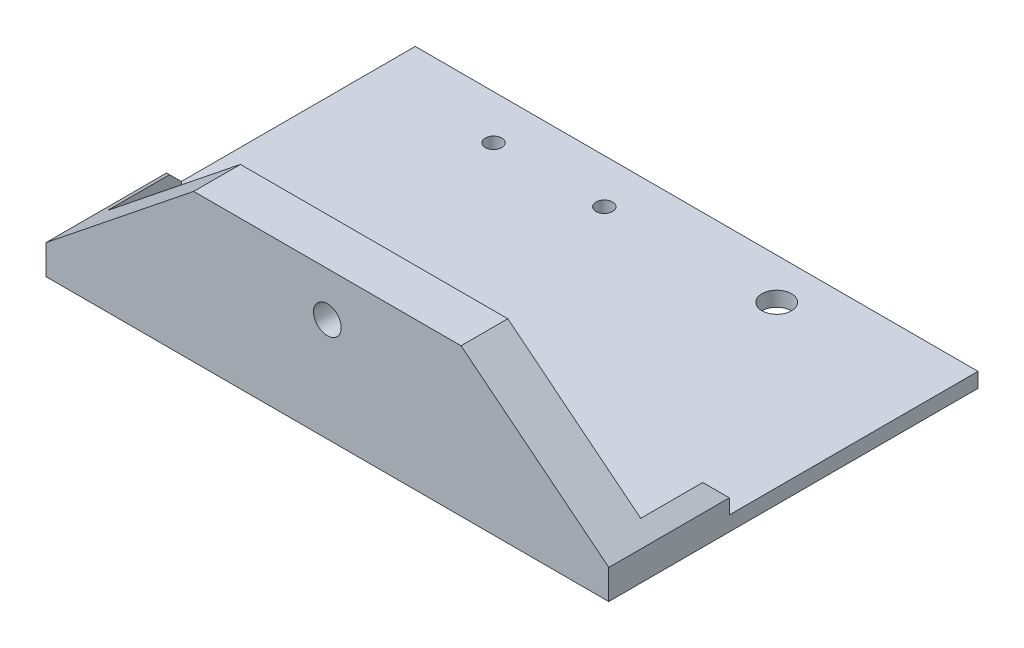
ISO-10303-21;
HEADER;
FILE_DESCRIPTION(('STEP AP214'),'2;1');
FILE_NAME('part.step','',(''),(''),'','','');
FILE_SCHEMA(('AUTOMOTIVE_DESIGN { 1 0 10303 214 1 1 1 1 }'));
ENDSEC;
DATA;
#1=APPLICATION_CONTEXT('core data for automotive mechanical design processes');
#2=APPLICATION_PROTOCOL_DEFINITION('international standard','automotive_design',2000,#1);
#3=PRODUCT_CONTEXT('',#1,'mechanical');
#4=PRODUCT('Part','Part','',(#3));
#5=PRODUCT_RELATED_PRODUCT_CATEGORY('part','',(#4));
#6=PRODUCT_DEFINITION_FORMATION('','',#4);
#7=PRODUCT_DEFINITION_CONTEXT('part definition',#1,'design');
#8=PRODUCT_DEFINITION('design','',#6,#7);
#9=PRODUCT_DEFINITION_SHAPE('','',#8);
#10=(LENGTH_UNIT() NAMED_UNIT(*) SI_UNIT(.MILLI.,.METRE.));
#11=(NAMED_UNIT(*) PLANE_ANGLE_UNIT() SI_UNIT($,.RADIAN.));
#12=(NAMED_UNIT(*) SI_UNIT($,.STERADIAN.) SOLID_ANGLE_UNIT());
#13=UNCERTAINTY_MEASURE_WITH_UNIT(LENGTH_MEASURE(1.E-05),#10,'distance_accuracy_value','');
#14=(GEOMETRIC_REPRESENTATION_CONTEXT(3) GLOBAL_UNCERTAINTY_ASSIGNED_CONTEXT((#13)) GLOBAL_UNIT_ASSIGNED_CONTEXT((#10,
#11,#12)) REPRESENTATION_CONTEXT('',''));
#15=CARTESIAN_POINT('',(0.,0.,0.));
#16=DIRECTION('',(0.,0.,1.));
#17=DIRECTION('',(1.,0.,0.));
#18=AXIS2_PLACEMENT_3D('',#15,#16,#17);
#19=CARTESIAN_POINT('',(67.4969911284804,2.54,2.36325475988103));
#20=DIRECTION('',(0.,0.,1.));
#21=DIRECTION('',(1.,0.,0.));
#22=AXIS2_PLACEMENT_3D('',#19,#20,#21);
#23=PLANE('',#22);
#24=DIRECTION('',(-1.,0.,0.));
#25=VECTOR('',#24,1.);
#26=CARTESIAN_POINT('',(67.4969911284804,0.,2.36325475988103));
#27=LINE('',#26,#25);
#28=CARTESIAN_POINT('',(78.4189911284804,0.,2.36325475988103));
#29=VERTEX_POINT('',#28);
#30=CARTESIAN_POINT('',(75.8789911284804,0.,2.36325475988102));
#31=VERTEX_POINT('',#30);
#32=EDGE_CURVE('E308',#29,#31,#27,.T.);
#33=ORIENTED_EDGE('',*,*,#32,.T.);
#34=DIRECTION('',(0.,-1.,0.));
#35=VECTOR('',#34,1.);
#36=CARTESIAN_POINT('',(75.8789911284804,2.54,2.36325475988102));
#37=LINE('',#36,#35);
#38=CARTESIAN_POINT('',(75.8789911284804,2.54,2.36325475988102));
#39=VERTEX_POINT('',#38);
#40=EDGE_CURVE('E252',#39,#31,#37,.T.);
#41=ORIENTED_EDGE('',*,*,#40,.F.);
#42=DIRECTION('',(-1.,0.,0.));
#43=VECTOR('',#42,1.);
#44=CARTESIAN_POINT('',(67.4969911284804,2.54,2.363254759881));
#45=LINE('',#44,#43);
#46=CARTESIAN_POINT('',(78.4189911284804,2.54,2.36325475988103));
#47=VERTEX_POINT('',#46);
#48=EDGE_CURVE('E335',#47,#39,#45,.T.);
#49=ORIENTED_EDGE('',*,*,#48,.F.);
#50=DIRECTION('',(0.,1.,0.));
#51=VECTOR('',#50,1.);
#52=CARTESIAN_POINT('',(78.4189911284804,0.,2.36325475988103));
#53=LINE('',#52,#51);
#54=EDGE_CURVE('E283',#29,#47,#53,.T.);
#55=ORIENTED_EDGE('',*,*,#54,.F.);
#56=EDGE_LOOP('',(#33,#41,#49,#55));
#57=FACE_BOUND('',#56,.T.);
#58=ADVANCED_FACE('F41',(#57),#23,.F.);
#59=CARTESIAN_POINT('',(-4.89300887151961,-2.54,-40.398073975292));
#60=DIRECTION('',(0.,0.,-1.));
#61=DIRECTION('',(-1.,0.,0.));
#62=AXIS2_PLACEMENT_3D('',#59,#60,#61);
#63=PLANE('',#62);
#64=DIRECTION('',(-1.,0.,0.));
#65=VECTOR('',#64,1.);
#66=CARTESIAN_POINT('',(67.4969911284804,0.,-40.398073975292));
#67=LINE('',#66,#65);
#68=CARTESIAN_POINT('',(78.4189911284804,0.,-40.398073975292));
#69=VERTEX_POINT('',#68);
#70=CARTESIAN_POINT('',(-18.3550088715196,0.,-40.398073975292));
#71=VERTEX_POINT('',#70);
#72=EDGE_CURVE('E307',#69,#71,#67,.T.);
#73=ORIENTED_EDGE('',*,*,#72,.F.);
#74=DIRECTION('',(0.,1.,0.));
#75=VECTOR('',#74,1.);
#76=CARTESIAN_POINT('',(78.4189911284804,-2.54,-40.398073975292));
#77=LINE('',#76,#75);
#78=CARTESIAN_POINT('',(78.4189911284804,-2.54,-40.398073975292));
#79=VERTEX_POINT('',#78);
#80=EDGE_CURVE('E294',#79,#69,#77,.T.);
#81=ORIENTED_EDGE('',*,*,#80,.F.);
#82=DIRECTION('',(-1.,0.,0.));
#83=VECTOR('',#82,1.);
#84=CARTESIAN_POINT('',(-4.89300887151961,-2.54,-40.398073975292));
#85=LINE('',#84,#83);
#86=CARTESIAN_POINT('',(-18.3550088715196,-2.54,-40.398073975292));
#87=VERTEX_POINT('',#86);
#88=EDGE_CURVE('E196',#79,#87,#85,.T.);
#89=ORIENTED_EDGE('',*,*,#88,.T.);
#90=DIRECTION('',(0.,-1.,0.));
#91=VECTOR('',#90,1.);
#92=CARTESIAN_POINT('',(-18.3550088715196,0.,-40.398073975292));
#93=LINE('',#92,#91);
#94=EDGE_CURVE('E267',#71,#87,#93,.T.);
#95=ORIENTED_EDGE('',*,*,#94,.F.);
#96=EDGE_LOOP('',(#73,#81,#89,#95));
#97=FACE_BOUND('',#96,.T.);
#98=ADVANCED_FACE('F354',(#97),#63,.T.);
#99=CARTESIAN_POINT('',(-4.8930088715196,-2.54,23.101926024708));
#100=DIRECTION('',(0.,0.,1.));
#101=DIRECTION('',(1.,0.,0.));
#102=AXIS2_PLACEMENT_3D('',#99,#100,#101);
#103=PLANE('',#102);
#104=DIRECTION('',(0.78086880944303,-0.624695047554424,0.));
#105=VECTOR('',#104,1.);
#106=CARTESIAN_POINT('',(30.0970399089682,41.1975609756098,23.101926024708));
#107=LINE('',#106,#105);
#108=CARTESIAN_POINT('',(53.0189911284804,22.86,23.101926024708));
#109=VERTEX_POINT('',#108);
#110=CARTESIAN_POINT('',(78.4189911284804,2.54,23.101926024708));
#111=VERTEX_POINT('',#110);
#112=EDGE_CURVE('E232',#109,#111,#107,.T.);
#113=ORIENTED_EDGE('',*,*,#112,.F.);
#114=DIRECTION('',(1.,0.,0.));
#115=VECTOR('',#114,1.);
#116=CARTESIAN_POINT('',(-4.8930088715196,22.86,23.101926024708));
#117=LINE('',#116,#115);
#118=CARTESIAN_POINT('',(7.0449911284804,22.86,23.101926024708));
#119=VERTEX_POINT('',#118);
#120=EDGE_CURVE('E162',#119,#109,#117,.T.);
#121=ORIENTED_EDGE('',*,*,#120,.F.);
#122=DIRECTION('',(0.78086880944303,0.624695047554424,0.));
#123=VECTOR('',#122,1.);
#124=CARTESIAN_POINT('',(-12.6245210666416,7.12439024390244,23.101926024708));
#125=LINE('',#124,#123);
#126=CARTESIAN_POINT('',(-18.3550088715196,2.54,23.101926024708));
#127=VERTEX_POINT('',#126);
#128=EDGE_CURVE('E137',#127,#119,#125,.T.);
#129=ORIENTED_EDGE('',*,*,#128,.F.);
#130=DIRECTION('',(0.,1.,0.));
#131=VECTOR('',#130,1.);
#132=CARTESIAN_POINT('',(-18.3550088715196,-2.54,23.101926024708));
#133=LINE('',#132,#131);
#134=CARTESIAN_POINT('',(-18.3550088715196,-2.54,23.101926024708));
#135=VERTEX_POINT('',#134);
#136=EDGE_CURVE('E275',#135,#127,#133,.T.);
#137=ORIENTED_EDGE('',*,*,#136,.F.);
#138=DIRECTION('',(1.,0.,0.));
#139=VECTOR('',#138,1.);
#140=CARTESIAN_POINT('',(-4.8930088715196,-2.54,23.101926024708));
#141=LINE('',#140,#139);
#142=CARTESIAN_POINT('',(78.4189911284804,-2.54,23.101926024708));
#143=VERTEX_POINT('',#142);
#144=EDGE_CURVE('E192',#135,#143,#141,.T.);
#145=ORIENTED_EDGE('',*,*,#144,.T.);
#146=DIRECTION('',(0.,-1.,0.));
#147=VECTOR('',#146,1.);
#148=CARTESIAN_POINT('',(78.4189911284804,22.86,23.101926024708));
#149=LINE('',#148,#147);
#150=EDGE_CURVE('E287',#111,#143,#149,.T.);
#151=ORIENTED_EDGE('',*,*,#150,.F.);
#152=EDGE_LOOP('',(#113,#121,#129,#137,#145,#151));
#153=FACE_BOUND('',#152,.T.);
#154=CARTESIAN_POINT('',(30.0319911284804,15.24,23.101926024708));
#155=DIRECTION('',(0.,0.,1.));
#156=DIRECTION('',(1.,0.,0.));
#157=AXIS2_PLACEMENT_3D('',#154,#155,#156);
#158=CIRCLE('',#157,2.38125);
#159=CARTESIAN_POINT('',(32.4132411284804,15.24,23.101926024708));
#160=VERTEX_POINT('',#159);
#161=EDGE_CURVE('E203',#160,#160,#158,.T.);
#162=ORIENTED_EDGE('',*,*,#161,.F.);
#163=EDGE_LOOP('',(#162));
#164=FACE_BOUND('',#163,.T.);
#165=ADVANCED_FACE('F43',(#153,#164),#103,.T.);
#166=CARTESIAN_POINT('',(0.,-2.54,0.));
#167=DIRECTION('',(0.,1.,0.));
#168=DIRECTION('',(0.,0.,1.));
#169=AXIS2_PLACEMENT_3D('',#166,#167,#168);
#170=PLANE('',#169);
#171=CARTESIAN_POINT('',(21.7769911284804,-2.54,-1.02807397529203));
#172=DIRECTION('',(0.,1.,0.));
#173=DIRECTION('',(0.,0.,1.));
#174=AXIS2_PLACEMENT_3D('',#171,#172,#173);
#175=CIRCLE('',#174,1.4224);
#176=CARTESIAN_POINT('',(21.7769911284804,-2.54,0.394326024707969));
#177=VERTEX_POINT('',#176);
#178=EDGE_CURVE('E161',#177,#177,#175,.T.);
#179=ORIENTED_EDGE('',*,*,#178,.T.);
#180=EDGE_LOOP('',(#179));
#181=FACE_BOUND('',#180,.T.);
#182=CARTESIAN_POINT('',(2.72699112848039,-2.54,-32.778073975292));
#183=DIRECTION('',(0.,1.,0.));
#184=DIRECTION('',(0.,0.,1.));
#185=AXIS2_PLACEMENT_3D('',#182,#183,#184);
#186=CIRCLE('',#185,1.4224);
#187=CARTESIAN_POINT('',(2.72699112848039,-2.54,-31.355673975292));
#188=VERTEX_POINT('',#187);
#189=EDGE_CURVE('E167',#188,#188,#186,.T.);
#190=ORIENTED_EDGE('',*,*,#189,.T.);
#191=EDGE_LOOP('',(#190));
#192=FACE_BOUND('',#191,.T.);
#193=CARTESIAN_POINT('',(2.72699112848039,-2.54,-1.02807397529203));
#194=DIRECTION('',(0.,1.,0.));
#195=DIRECTION('',(0.,0.,1.));
#196=AXIS2_PLACEMENT_3D('',#193,#194,#195);
#197=CIRCLE('',#196,1.4224);
#198=CARTESIAN_POINT('',(2.72699112848039,-2.54,0.394326024707968));
#199=VERTEX_POINT('',#198);
#200=EDGE_CURVE('E176',#199,#199,#197,.T.);
#201=ORIENTED_EDGE('',*,*,#200,.T.);
#202=EDGE_LOOP('',(#201));
#203=FACE_BOUND('',#202,.T.);
#204=CARTESIAN_POINT('',(21.7769911284804,-2.54,-32.778073975292));
#205=DIRECTION('',(0.,1.,0.));
#206=DIRECTION('',(0.,0.,1.));
#207=AXIS2_PLACEMENT_3D('',#204,#205,#206);
#208=CIRCLE('',#207,1.4224);
#209=CARTESIAN_POINT('',(21.7769911284804,-2.54,-31.355673975292));
#210=VERTEX_POINT('',#209);
#211=EDGE_CURVE('E180',#210,#210,#208,.T.);
#212=ORIENTED_EDGE('',*,*,#211,.T.);
#213=EDGE_LOOP('',(#212));
#214=FACE_BOUND('',#213,.T.);
#215=CARTESIAN_POINT('',(50.8254928686398,-2.54,-33.377706685628));
#216=DIRECTION('',(0.,1.,0.));
#217=DIRECTION('',(0.,0.,1.));
#218=AXIS2_PLACEMENT_3D('',#215,#216,#217);
#219=CIRCLE('',#218,2.53999999999999);
#220=CARTESIAN_POINT('',(50.8254928686398,-2.54,-30.837706685628));
#221=VERTEX_POINT('',#220);
#222=EDGE_CURVE('E184',#221,#221,#219,.T.);
#223=ORIENTED_EDGE('',*,*,#222,.T.);
#224=EDGE_LOOP('',(#223));
#225=FACE_BOUND('',#224,.T.);
#226=CARTESIAN_POINT('',(49.6808402266424,-2.54,9.80229331437196));
#227=DIRECTION('',(0.,1.,0.));
#228=DIRECTION('',(0.,0.,1.));
#229=AXIS2_PLACEMENT_3D('',#226,#227,#228);
#230=CIRCLE('',#229,2.54);
#231=CARTESIAN_POINT('',(49.6808402266424,-2.54,12.342293314372));
#232=VERTEX_POINT('',#231);
#233=EDGE_CURVE('E188',#232,#232,#230,.T.);
#234=ORIENTED_EDGE('',*,*,#233,.T.);
#235=EDGE_LOOP('',(#234));
#236=FACE_BOUND('',#235,.T.);
#237=ORIENTED_EDGE('',*,*,#144,.F.);
#238=DIRECTION('',(0.,0.,1.));
#239=VECTOR('',#238,1.);
#240=CARTESIAN_POINT('',(-18.3550088715196,-2.54,-40.398073975292));
#241=LINE('',#240,#239);
#242=EDGE_CURVE('E271',#87,#135,#241,.T.);
#243=ORIENTED_EDGE('',*,*,#242,.F.);
#244=ORIENTED_EDGE('',*,*,#88,.F.);
#245=DIRECTION('',(0.,0.,-1.));
#246=VECTOR('',#245,1.);
#247=CARTESIAN_POINT('',(78.4189911284804,-2.54,23.101926024708));
#248=LINE('',#247,#246);
#249=EDGE_CURVE('E290',#143,#79,#248,.T.);
#250=ORIENTED_EDGE('',*,*,#249,.F.);
#251=EDGE_LOOP('',(#237,#243,#244,#250));
#252=FACE_BOUND('',#251,.T.);
#253=ADVANCED_FACE('F360',(#181,#192,#203,#214,#225,#236,#252),#170,.F.);
#254=CARTESIAN_POINT('',(49.6808402266424,-2.54,9.80229331437196));
#255=DIRECTION('',(0.,1.,0.));
#256=DIRECTION('',(0.,0.,1.));
#257=AXIS2_PLACEMENT_3D('',#254,#255,#256);
#258=CYLINDRICAL_SURFACE('',#257,2.54);
#259=CARTESIAN_POINT('',(49.6808402266424,0.,9.80229331437196));
#260=DIRECTION('',(0.,-1.,0.));
#261=DIRECTION('',(0.,0.,-1.));
#262=AXIS2_PLACEMENT_3D('',#259,#260,#261);
#263=CIRCLE('',#262,2.54);
#264=CARTESIAN_POINT('',(49.6808402266424,0.,7.26229331437196));
#265=VERTEX_POINT('',#264);
#266=EDGE_CURVE('E303',#265,#265,#263,.F.);
#267=ORIENTED_EDGE('',*,*,#266,.T.);
#268=EDGE_LOOP('',(#267));
#269=FACE_BOUND('',#268,.T.);
#270=ORIENTED_EDGE('',*,*,#233,.F.);
#271=EDGE_LOOP('',(#270));
#272=FACE_BOUND('',#271,.T.);
#273=ADVANCED_FACE('F434',(#269,#272),#258,.F.);
#274=CARTESIAN_POINT('',(50.8254928686398,-2.54,-33.377706685628));
#275=DIRECTION('',(0.,1.,0.));
#276=DIRECTION('',(0.,0.,1.));
#277=AXIS2_PLACEMENT_3D('',#274,#275,#276);
#278=CYLINDRICAL_SURFACE('',#277,2.53999999999999);
#279=CARTESIAN_POINT('',(50.8254928686398,0.,-33.377706685628));
#280=DIRECTION('',(0.,-1.,0.));
#281=DIRECTION('',(0.,0.,-1.));
#282=AXIS2_PLACEMENT_3D('',#279,#280,#281);
#283=CIRCLE('',#282,2.53999999999999);
#284=CARTESIAN_POINT('',(50.8254928686398,0.,-35.917706685628));
#285=VERTEX_POINT('',#284);
#286=EDGE_CURVE('E331',#285,#285,#283,.F.);
#287=ORIENTED_EDGE('',*,*,#286,.T.);
#288=EDGE_LOOP('',(#287));
#289=FACE_BOUND('',#288,.T.);
#290=ORIENTED_EDGE('',*,*,#222,.F.);
#291=EDGE_LOOP('',(#290));
#292=FACE_BOUND('',#291,.T.);
#293=ADVANCED_FACE('F430',(#289,#292),#278,.F.);
#294=CARTESIAN_POINT('',(21.7769911284804,-2.54,-32.778073975292));
#295=DIRECTION('',(0.,1.,0.));
#296=DIRECTION('',(0.,0.,1.));
#297=AXIS2_PLACEMENT_3D('',#294,#295,#296);
#298=CYLINDRICAL_SURFACE('',#297,1.4224);
#299=CARTESIAN_POINT('',(21.7769911284804,0.,-32.778073975292));
#300=DIRECTION('',(0.,-1.,0.));
#301=DIRECTION('',(0.,0.,-1.));
#302=AXIS2_PLACEMENT_3D('',#299,#300,#301);
#303=CIRCLE('',#302,1.4224);
#304=CARTESIAN_POINT('',(21.7769911284804,0.,-34.200473975292));
#305=VERTEX_POINT('',#304);
#306=EDGE_CURVE('E327',#305,#305,#303,.F.);
#307=ORIENTED_EDGE('',*,*,#306,.T.);
#308=EDGE_LOOP('',(#307));
#309=FACE_BOUND('',#308,.T.);
#310=ORIENTED_EDGE('',*,*,#211,.F.);
#311=EDGE_LOOP('',(#310));
#312=FACE_BOUND('',#311,.T.);
#313=ADVANCED_FACE('F426',(#309,#312),#298,.F.);
#314=CARTESIAN_POINT('',(2.72699112848039,-2.54,-1.02807397529203));
#315=DIRECTION('',(0.,1.,0.));
#316=DIRECTION('',(0.,0.,1.));
#317=AXIS2_PLACEMENT_3D('',#314,#315,#316);
#318=CYLINDRICAL_SURFACE('',#317,1.4224);
#319=CARTESIAN_POINT('',(2.72699112848039,0.,-1.02807397529203));
#320=DIRECTION('',(0.,-1.,0.));
#321=DIRECTION('',(0.,0.,-1.));
#322=AXIS2_PLACEMENT_3D('',#319,#320,#321);
#323=CIRCLE('',#322,1.4224);
#324=CARTESIAN_POINT('',(2.72699112848039,0.,-2.45047397529203));
#325=VERTEX_POINT('',#324);
#326=EDGE_CURVE('E323',#325,#325,#323,.F.);
#327=ORIENTED_EDGE('',*,*,#326,.T.);
#328=EDGE_LOOP('',(#327));
#329=FACE_BOUND('',#328,.T.);
#330=ORIENTED_EDGE('',*,*,#200,.F.);
#331=EDGE_LOOP('',(#330));
#332=FACE_BOUND('',#331,.T.);
#333=ADVANCED_FACE('F422',(#329,#332),#318,.F.);
#334=CARTESIAN_POINT('',(2.72699112848039,-2.54,-32.778073975292));
#335=DIRECTION('',(0.,1.,0.));
#336=DIRECTION('',(0.,0.,1.));
#337=AXIS2_PLACEMENT_3D('',#334,#335,#336);
#338=CYLINDRICAL_SURFACE('',#337,1.4224);
#339=CARTESIAN_POINT('',(2.72699112848039,0.,-32.778073975292));
#340=DIRECTION('',(0.,-1.,0.));
#341=DIRECTION('',(0.,0.,-1.));
#342=AXIS2_PLACEMENT_3D('',#339,#340,#341);
#343=CIRCLE('',#342,1.4224);
#344=CARTESIAN_POINT('',(2.72699112848039,0.,-34.200473975292));
#345=VERTEX_POINT('',#344);
#346=EDGE_CURVE('E319',#345,#345,#343,.F.);
#347=ORIENTED_EDGE('',*,*,#346,.T.);
#348=EDGE_LOOP('',(#347));
#349=FACE_BOUND('',#348,.T.);
#350=ORIENTED_EDGE('',*,*,#189,.F.);
#351=EDGE_LOOP('',(#350));
#352=FACE_BOUND('',#351,.T.);
#353=ADVANCED_FACE('F418',(#349,#352),#338,.F.);
#354=CARTESIAN_POINT('',(21.7769911284804,-2.54,-1.02807397529203));
#355=DIRECTION('',(0.,1.,0.));
#356=DIRECTION('',(0.,0.,1.));
#357=AXIS2_PLACEMENT_3D('',#354,#355,#356);
#358=CYLINDRICAL_SURFACE('',#357,1.4224);
#359=CARTESIAN_POINT('',(21.7769911284804,0.,-1.02807397529203));
#360=DIRECTION('',(0.,-1.,0.));
#361=DIRECTION('',(0.,0.,-1.));
#362=AXIS2_PLACEMENT_3D('',#359,#360,#361);
#363=CIRCLE('',#362,1.4224);
#364=CARTESIAN_POINT('',(21.7769911284804,0.,-2.45047397529203));
#365=VERTEX_POINT('',#364);
#366=EDGE_CURVE('E312',#365,#365,#363,.F.);
#367=ORIENTED_EDGE('',*,*,#366,.T.);
#368=EDGE_LOOP('',(#367));
#369=FACE_BOUND('',#368,.T.);
#370=ORIENTED_EDGE('',*,*,#178,.F.);
#371=EDGE_LOOP('',(#370));
#372=FACE_BOUND('',#371,.T.);
#373=ADVANCED_FACE('F415',(#369,#372),#358,.F.);
#374=CARTESIAN_POINT('',(-4.8930088715196,22.86,15.063254759881));
#375=DIRECTION('',(0.,0.,1.));
#376=DIRECTION('',(1.,0.,0.));
#377=AXIS2_PLACEMENT_3D('',#374,#375,#376);
#378=PLANE('',#377);
#379=DIRECTION('',(-1.,0.,0.));
#380=VECTOR('',#379,1.);
#381=CARTESIAN_POINT('',(-4.8930088715196,22.86,15.063254759881));
#382=LINE('',#381,#380);
#383=CARTESIAN_POINT('',(53.0189911284804,22.86,15.063254759881));
#384=VERTEX_POINT('',#383);
#385=CARTESIAN_POINT('',(7.0449911284804,22.86,15.063254759881));
#386=VERTEX_POINT('',#385);
#387=EDGE_CURVE('E152',#384,#386,#382,.T.);
#388=ORIENTED_EDGE('',*,*,#387,.F.);
#389=DIRECTION('',(0.78086880944303,-0.624695047554424,0.));
#390=VECTOR('',#389,1.);
#391=CARTESIAN_POINT('',(17.7067960065292,51.109756097561,15.063254759881));
#392=LINE('',#391,#390);
#393=CARTESIAN_POINT('',(75.8789911284804,4.57200000000001,15.063254759881));
#394=VERTEX_POINT('',#393);
#395=EDGE_CURVE('E229',#384,#394,#392,.T.);
#396=ORIENTED_EDGE('',*,*,#395,.T.);
#397=DIRECTION('',(0.,1.,0.));
#398=VECTOR('',#397,1.);
#399=CARTESIAN_POINT('',(75.8789911284804,0.,15.063254759881));
#400=LINE('',#399,#398);
#401=CARTESIAN_POINT('',(75.8789911284804,0.,15.063254759881));
#402=VERTEX_POINT('',#401);
#403=EDGE_CURVE('E245',#402,#394,#400,.T.);
#404=ORIENTED_EDGE('',*,*,#403,.F.);
#405=DIRECTION('',(-1.,0.,0.));
#406=VECTOR('',#405,1.);
#407=CARTESIAN_POINT('',(64.9569911284804,0.,15.063254759881));
#408=LINE('',#407,#406);
#409=CARTESIAN_POINT('',(-15.8150088715196,0.,15.063254759881));
#410=VERTEX_POINT('',#409);
#411=EDGE_CURVE('E202',#402,#410,#408,.T.);
#412=ORIENTED_EDGE('',*,*,#411,.T.);
#413=DIRECTION('',(0.,-1.,0.));
#414=VECTOR('',#413,1.);
#415=CARTESIAN_POINT('',(-15.8150088715196,15.24,15.063254759881));
#416=LINE('',#415,#414);
#417=CARTESIAN_POINT('',(-15.8150088715196,4.572,15.063254759881));
#418=VERTEX_POINT('',#417);
#419=EDGE_CURVE('E154',#418,#410,#416,.T.);
#420=ORIENTED_EDGE('',*,*,#419,.F.);
#421=DIRECTION('',(0.78086880944303,0.624695047554424,0.));
#422=VECTOR('',#421,1.);
#423=CARTESIAN_POINT('',(-0.23427716420253,17.0365853658537,15.063254759881));
#424=LINE('',#423,#422);
#425=EDGE_CURVE('E64',#418,#386,#424,.T.);
#426=ORIENTED_EDGE('',*,*,#425,.T.);
#427=EDGE_LOOP('',(#388,#396,#404,#412,#420,#426));
#428=FACE_BOUND('',#427,.T.);
#429=CARTESIAN_POINT('',(30.0319911284804,15.24,15.063254759881));
#430=DIRECTION('',(0.,0.,1.));
#431=DIRECTION('',(1.,0.,0.));
#432=AXIS2_PLACEMENT_3D('',#429,#430,#431);
#433=CIRCLE('',#432,2.38125);
#434=CARTESIAN_POINT('',(32.4132411284804,15.24,15.063254759881));
#435=VERTEX_POINT('',#434);
#436=EDGE_CURVE('E199',#435,#435,#433,.T.);
#437=ORIENTED_EDGE('',*,*,#436,.T.);
#438=EDGE_LOOP('',(#437));
#439=FACE_BOUND('',#438,.T.);
#440=ADVANCED_FACE('F149',(#428,#439),#378,.F.);
#441=CARTESIAN_POINT('',(0.,22.86,0.));
#442=DIRECTION('',(0.,-1.,0.));
#443=DIRECTION('',(0.,0.,-1.));
#444=AXIS2_PLACEMENT_3D('',#441,#442,#443);
#445=PLANE('',#444);
#446=ORIENTED_EDGE('',*,*,#120,.T.);
#447=DIRECTION('',(0.,0.,1.));
#448=VECTOR('',#447,1.);
#449=CARTESIAN_POINT('',(53.0189911284804,22.86,-40.398073975292));
#450=LINE('',#449,#448);
#451=EDGE_CURVE('E143',#384,#109,#450,.T.);
#452=ORIENTED_EDGE('',*,*,#451,.F.);
#453=ORIENTED_EDGE('',*,*,#387,.T.);
#454=DIRECTION('',(0.,0.,1.));
#455=VECTOR('',#454,1.);
#456=CARTESIAN_POINT('',(7.0449911284804,22.86,-40.398073975292));
#457=LINE('',#456,#455);
#458=EDGE_CURVE('E134',#386,#119,#457,.T.);
#459=ORIENTED_EDGE('',*,*,#458,.T.);
#460=EDGE_LOOP('',(#446,#452,#453,#459));
#461=FACE_BOUND('',#460,.T.);
#462=ADVANCED_FACE('F159',(#461),#445,.F.);
#463=CARTESIAN_POINT('',(-7.4330088715196,15.24,15.063254759881));
#464=DIRECTION('',(0.,-0.707106781186548,0.707106781186548));
#465=DIRECTION('',(0.,-0.707106781186548,-0.707106781186548));
#466=AXIS2_PLACEMENT_3D('',#463,#464,#465);
#467=PLANE('',#466);
#468=DIRECTION('',(1.,0.,0.));
#469=VECTOR('',#468,1.);
#470=CARTESIAN_POINT('',(-7.43300887151961,2.54,2.36325475988103));
#471=LINE('',#470,#469);
#472=CARTESIAN_POINT('',(-18.3550088715196,2.54,2.36325475988103));
#473=VERTEX_POINT('',#472);
#474=CARTESIAN_POINT('',(-15.8150088715196,2.54,2.36325475988104));
#475=VERTEX_POINT('',#474);
#476=EDGE_CURVE('E169',#473,#475,#471,.T.);
#477=ORIENTED_EDGE('',*,*,#476,.F.);
#478=DIRECTION('',(0.662266178532522,0.529812942826018,0.529812942826018));
#479=VECTOR('',#478,1.);
#480=CARTESIAN_POINT('',(-4.65237729257223,13.5021052631579,13.3253600230389));
#481=LINE('',#480,#479);
#482=CARTESIAN_POINT('',(-15.8150088715196,4.572,4.39525475988103));
#483=VERTEX_POINT('',#482);
#484=EDGE_CURVE('E156',#473,#483,#481,.T.);
#485=ORIENTED_EDGE('',*,*,#484,.T.);
#486=DIRECTION('',(0.,0.707106781186547,0.707106781186547));
#487=VECTOR('',#486,1.);
#488=CARTESIAN_POINT('',(-15.8150088715196,2.54,2.36325475988104));
#489=LINE('',#488,#487);
#490=EDGE_CURVE('E209',#475,#483,#489,.T.);
#491=ORIENTED_EDGE('',*,*,#490,.F.);
#492=EDGE_LOOP('',(#477,#485,#491));
#493=FACE_BOUND('',#492,.T.);
#494=ADVANCED_FACE('F214',(#493),#467,.F.);
#495=CARTESIAN_POINT('',(67.4969911284804,15.24,15.063254759881));
#496=DIRECTION('',(0.,-0.707106781186548,0.707106781186548));
#497=DIRECTION('',(0.,-0.707106781186548,-0.707106781186548));
#498=AXIS2_PLACEMENT_3D('',#495,#496,#497);
#499=PLANE('',#498);
#500=DIRECTION('',(0.,-0.707106781186548,-0.707106781186547));
#501=VECTOR('',#500,1.);
#502=CARTESIAN_POINT('',(75.8789911284804,15.24,15.063254759881));
#503=LINE('',#502,#501);
#504=CARTESIAN_POINT('',(75.8789911284804,4.57200000000001,4.39525475988103));
#505=VERTEX_POINT('',#504);
#506=EDGE_CURVE('E249',#505,#39,#503,.T.);
#507=ORIENTED_EDGE('',*,*,#506,.F.);
#508=DIRECTION('',(0.662266178532522,-0.529812942826018,-0.529812942826018));
#509=VECTOR('',#508,1.);
#510=CARTESIAN_POINT('',(64.716359549533,13.5021052631579,13.3253600230389));
#511=LINE('',#510,#509);
#512=EDGE_CURVE('E57',#505,#47,#511,.T.);
#513=ORIENTED_EDGE('',*,*,#512,.T.);
#514=ORIENTED_EDGE('',*,*,#48,.T.);
#515=EDGE_LOOP('',(#507,#513,#514));
#516=FACE_BOUND('',#515,.T.);
#517=ADVANCED_FACE('F373',(#516),#499,.F.);
#518=CARTESIAN_POINT('',(67.4969911284804,0.,2.36325475988103));
#519=DIRECTION('',(0.,-1.,0.));
#520=DIRECTION('',(0.,0.,-1.));
#521=AXIS2_PLACEMENT_3D('',#518,#519,#520);
#522=PLANE('',#521);
#523=ORIENTED_EDGE('',*,*,#306,.F.);
#524=EDGE_LOOP('',(#523));
#525=FACE_BOUND('',#524,.T.);
#526=ORIENTED_EDGE('',*,*,#346,.F.);
#527=EDGE_LOOP('',(#526));
#528=FACE_BOUND('',#527,.T.);
#529=ORIENTED_EDGE('',*,*,#72,.T.);
#530=DIRECTION('',(0.,0.,-1.));
#531=VECTOR('',#530,1.);
#532=CARTESIAN_POINT('',(-18.3550088715196,0.,2.36325475988104));
#533=LINE('',#532,#531);
#534=CARTESIAN_POINT('',(-18.3550088715196,0.,2.36325475988104));
#535=VERTEX_POINT('',#534);
#536=EDGE_CURVE('E263',#535,#71,#533,.T.);
#537=ORIENTED_EDGE('',*,*,#536,.F.);
#538=CARTESIAN_POINT('',(-15.8150088715196,0.,2.36325475988104));
#539=VERTEX_POINT('',#538);
#540=EDGE_CURVE('E313',#539,#535,#27,.T.);
#541=ORIENTED_EDGE('',*,*,#540,.F.);
#542=DIRECTION('',(0.,0.,-1.));
#543=VECTOR('',#542,1.);
#544=CARTESIAN_POINT('',(-15.8150088715196,0.,15.063254759881));
#545=LINE('',#544,#543);
#546=EDGE_CURVE('E242',#410,#539,#545,.T.);
#547=ORIENTED_EDGE('',*,*,#546,.F.);
#548=ORIENTED_EDGE('',*,*,#411,.F.);
#549=DIRECTION('',(0.,0.,1.));
#550=VECTOR('',#549,1.);
#551=CARTESIAN_POINT('',(75.8789911284804,0.,2.36325475988102));
#552=LINE('',#551,#550);
#553=EDGE_CURVE('E255',#31,#402,#552,.T.);
#554=ORIENTED_EDGE('',*,*,#553,.F.);
#555=ORIENTED_EDGE('',*,*,#32,.F.);
#556=DIRECTION('',(0.,0.,1.));
#557=VECTOR('',#556,1.);
#558=CARTESIAN_POINT('',(78.4189911284804,0.,-40.398073975292));
#559=LINE('',#558,#557);
#560=EDGE_CURVE('E279',#69,#29,#559,.T.);
#561=ORIENTED_EDGE('',*,*,#560,.F.);
#562=EDGE_LOOP('',(#529,#537,#541,#547,#548,#554,#555,#561));
#563=FACE_BOUND('',#562,.T.);
#564=ORIENTED_EDGE('',*,*,#366,.F.);
#565=EDGE_LOOP('',(#564));
#566=FACE_BOUND('',#565,.T.);
#567=ORIENTED_EDGE('',*,*,#326,.F.);
#568=EDGE_LOOP('',(#567));
#569=FACE_BOUND('',#568,.T.);
#570=ORIENTED_EDGE('',*,*,#286,.F.);
#571=EDGE_LOOP('',(#570));
#572=FACE_BOUND('',#571,.T.);
#573=ORIENTED_EDGE('',*,*,#266,.F.);
#574=EDGE_LOOP('',(#573));
#575=FACE_BOUND('',#574,.T.);
#576=ADVANCED_FACE('F348',(#525,#528,#563,#566,#569,#572,#575),#522,.F.);
#577=ORIENTED_EDGE('',*,*,#476,.T.);
#578=DIRECTION('',(0.,1.,0.));
#579=VECTOR('',#578,1.);
#580=CARTESIAN_POINT('',(-15.8150088715196,0.,2.36325475988104));
#581=LINE('',#580,#579);
#582=EDGE_CURVE('E235',#539,#475,#581,.T.);
#583=ORIENTED_EDGE('',*,*,#582,.F.);
#584=ORIENTED_EDGE('',*,*,#540,.T.);
#585=DIRECTION('',(0.,-1.,0.));
#586=VECTOR('',#585,1.);
#587=CARTESIAN_POINT('',(-18.3550088715196,2.54,2.36325475988104));
#588=LINE('',#587,#586);
#589=EDGE_CURVE('E259',#473,#535,#588,.T.);
#590=ORIENTED_EDGE('',*,*,#589,.F.);
#591=EDGE_LOOP('',(#577,#583,#584,#590));
#592=FACE_BOUND('',#591,.T.);
#593=ADVANCED_FACE('F341',(#592),#23,.F.);
#594=CARTESIAN_POINT('',(30.0319911284804,15.24,-40.398073975292));
#595=DIRECTION('',(0.,0.,1.));
#596=DIRECTION('',(1.,0.,0.));
#597=AXIS2_PLACEMENT_3D('',#594,#595,#596);
#598=CYLINDRICAL_SURFACE('',#597,2.38125);
#599=ORIENTED_EDGE('',*,*,#161,.T.);
#600=EDGE_LOOP('',(#599));
#601=FACE_BOUND('',#600,.T.);
#602=ORIENTED_EDGE('',*,*,#436,.F.);
#603=EDGE_LOOP('',(#602));
#604=FACE_BOUND('',#603,.T.);
#605=ADVANCED_FACE('F395',(#601,#604),#598,.F.);
#606=CARTESIAN_POINT('',(78.4189911284804,0.,0.));
#607=DIRECTION('',(-1.,0.,0.));
#608=DIRECTION('',(0.,0.,1.));
#609=AXIS2_PLACEMENT_3D('',#606,#607,#608);
#610=PLANE('',#609);
#611=ORIENTED_EDGE('',*,*,#54,.T.);
#612=DIRECTION('',(0.,0.,1.));
#613=VECTOR('',#612,1.);
#614=CARTESIAN_POINT('',(78.4189911284804,2.54,-40.398073975292));
#615=LINE('',#614,#613);
#616=EDGE_CURVE('E218',#47,#111,#615,.T.);
#617=ORIENTED_EDGE('',*,*,#616,.T.);
#618=ORIENTED_EDGE('',*,*,#150,.T.);
#619=ORIENTED_EDGE('',*,*,#249,.T.);
#620=ORIENTED_EDGE('',*,*,#80,.T.);
#621=ORIENTED_EDGE('',*,*,#560,.T.);
#622=EDGE_LOOP('',(#611,#617,#618,#619,#620,#621));
#623=FACE_BOUND('',#622,.T.);
#624=ADVANCED_FACE('F356',(#623),#610,.F.);
#625=CARTESIAN_POINT('',(-18.3550088715196,0.,0.));
#626=DIRECTION('',(-1.,0.,0.));
#627=DIRECTION('',(0.,0.,1.));
#628=AXIS2_PLACEMENT_3D('',#625,#626,#627);
#629=PLANE('',#628);
#630=DIRECTION('',(0.,0.,1.));
#631=VECTOR('',#630,1.);
#632=CARTESIAN_POINT('',(-18.3550088715196,2.54,-40.398073975292));
#633=LINE('',#632,#631);
#634=EDGE_CURVE('E144',#473,#127,#633,.T.);
#635=ORIENTED_EDGE('',*,*,#634,.F.);
#636=ORIENTED_EDGE('',*,*,#589,.T.);
#637=ORIENTED_EDGE('',*,*,#536,.T.);
#638=ORIENTED_EDGE('',*,*,#94,.T.);
#639=ORIENTED_EDGE('',*,*,#242,.T.);
#640=ORIENTED_EDGE('',*,*,#136,.T.);
#641=EDGE_LOOP('',(#635,#636,#637,#638,#639,#640));
#642=FACE_BOUND('',#641,.T.);
#643=ADVANCED_FACE('F345',(#642),#629,.T.);
#644=CARTESIAN_POINT('',(75.8789911284804,0.,0.));
#645=DIRECTION('',(1.,0.,0.));
#646=DIRECTION('',(0.,0.,-1.));
#647=AXIS2_PLACEMENT_3D('',#644,#645,#646);
#648=PLANE('',#647);
#649=ORIENTED_EDGE('',*,*,#403,.T.);
#650=DIRECTION('',(0.,0.,-1.));
#651=VECTOR('',#650,1.);
#652=CARTESIAN_POINT('',(75.8789911284804,4.57200000000001,0.));
#653=LINE('',#652,#651);
#654=EDGE_CURVE('E11',#394,#505,#653,.T.);
#655=ORIENTED_EDGE('',*,*,#654,.T.);
#656=ORIENTED_EDGE('',*,*,#506,.T.);
#657=ORIENTED_EDGE('',*,*,#40,.T.);
#658=ORIENTED_EDGE('',*,*,#553,.T.);
#659=EDGE_LOOP('',(#649,#655,#656,#657,#658));
#660=FACE_BOUND('',#659,.T.);
#661=ADVANCED_FACE('F375',(#660),#648,.F.);
#662=CARTESIAN_POINT('',(-15.8150088715196,0.,0.));
#663=DIRECTION('',(-1.,0.,0.));
#664=DIRECTION('',(0.,0.,1.));
#665=AXIS2_PLACEMENT_3D('',#662,#663,#664);
#666=PLANE('',#665);
#667=ORIENTED_EDGE('',*,*,#490,.T.);
#668=DIRECTION('',(0.,0.,1.));
#669=VECTOR('',#668,1.);
#670=CARTESIAN_POINT('',(-15.8150088715196,4.572,0.));
#671=LINE('',#670,#669);
#672=EDGE_CURVE('E50',#483,#418,#671,.T.);
#673=ORIENTED_EDGE('',*,*,#672,.T.);
#674=ORIENTED_EDGE('',*,*,#419,.T.);
#675=ORIENTED_EDGE('',*,*,#546,.T.);
#676=ORIENTED_EDGE('',*,*,#582,.T.);
#677=EDGE_LOOP('',(#667,#673,#674,#675,#676));
#678=FACE_BOUND('',#677,.T.);
#679=ADVANCED_FACE('F207',(#678),#666,.F.);
#680=CARTESIAN_POINT('',(7.0449911284804,22.86,-40.398073975292));
#681=DIRECTION('',(0.624695047554424,-0.78086880944303,0.));
#682=DIRECTION('',(0.78086880944303,0.624695047554424,0.));
#683=AXIS2_PLACEMENT_3D('',#680,#681,#682);
#684=PLANE('',#683);
#685=ORIENTED_EDGE('',*,*,#128,.T.);
#686=ORIENTED_EDGE('',*,*,#458,.F.);
#687=ORIENTED_EDGE('',*,*,#425,.F.);
#688=ORIENTED_EDGE('',*,*,#672,.F.);
#689=ORIENTED_EDGE('',*,*,#484,.F.);
#690=ORIENTED_EDGE('',*,*,#634,.T.);
#691=EDGE_LOOP('',(#685,#686,#687,#688,#689,#690));
#692=FACE_BOUND('',#691,.T.);
#693=ADVANCED_FACE('F135',(#692),#684,.F.);
#694=CARTESIAN_POINT('',(53.0189911284804,22.86,-40.398073975292));
#695=DIRECTION('',(-0.624695047554424,-0.78086880944303,0.));
#696=DIRECTION('',(0.78086880944303,-0.624695047554424,0.));
#697=AXIS2_PLACEMENT_3D('',#694,#695,#696);
#698=PLANE('',#697);
#699=ORIENTED_EDGE('',*,*,#112,.T.);
#700=ORIENTED_EDGE('',*,*,#616,.F.);
#701=ORIENTED_EDGE('',*,*,#512,.F.);
#702=ORIENTED_EDGE('',*,*,#654,.F.);
#703=ORIENTED_EDGE('',*,*,#395,.F.);
#704=ORIENTED_EDGE('',*,*,#451,.T.);
#705=EDGE_LOOP('',(#699,#700,#701,#702,#703,#704));
#706=FACE_BOUND('',#705,.T.);
#707=ADVANCED_FACE('F366',(#706),#698,.F.);
#708=CLOSED_SHELL('',(#58,#98,#165,#253,#273,#293,#313,#333,#353,#373,#440,#462,#494,#517,#576,
#593,#605,#624,#643,#661,#679,#693,#707));
#709=MANIFOLD_SOLID_BREP('B2',#708);
#710=ADVANCED_BREP_SHAPE_REPRESENTATION('',(#18,#709),#14);
#711=SHAPE_DEFINITION_REPRESENTATION(#9,#710);
ENDSEC;
END-ISO-10303-21;
